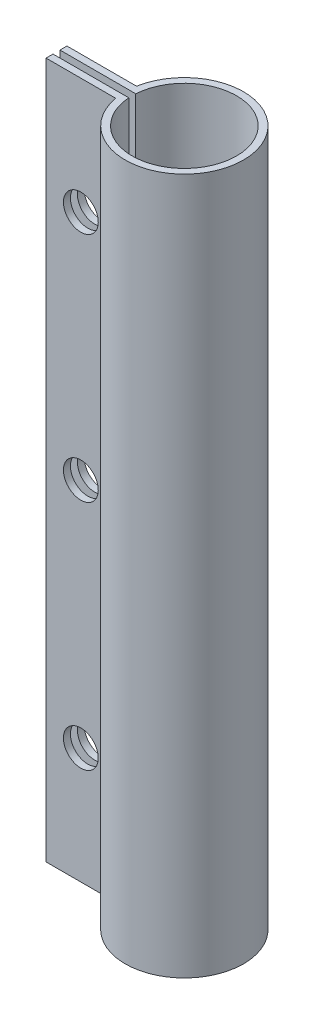
ISO-10303-21;
HEADER;
FILE_DESCRIPTION(('STEP AP214'),'2;1');
FILE_NAME('part.step','',(''),(''),'','','');
FILE_SCHEMA(('AUTOMOTIVE_DESIGN { 1 0 10303 214 1 1 1 1 }'));
ENDSEC;
DATA;
#1=APPLICATION_CONTEXT('core data for automotive mechanical design processes');
#2=APPLICATION_PROTOCOL_DEFINITION('international standard','automotive_design',2000,#1);
#3=PRODUCT_CONTEXT('',#1,'mechanical');
#4=PRODUCT('Part','Part','',(#3));
#5=PRODUCT_RELATED_PRODUCT_CATEGORY('part','',(#4));
#6=PRODUCT_DEFINITION_FORMATION('','',#4);
#7=PRODUCT_DEFINITION_CONTEXT('part definition',#1,'design');
#8=PRODUCT_DEFINITION('design','',#6,#7);
#9=PRODUCT_DEFINITION_SHAPE('','',#8);
#10=(LENGTH_UNIT() NAMED_UNIT(*) SI_UNIT(.MILLI.,.METRE.));
#11=(NAMED_UNIT(*) PLANE_ANGLE_UNIT() SI_UNIT($,.RADIAN.));
#12=(NAMED_UNIT(*) SI_UNIT($,.STERADIAN.) SOLID_ANGLE_UNIT());
#13=UNCERTAINTY_MEASURE_WITH_UNIT(LENGTH_MEASURE(1.E-05),#10,'distance_accuracy_value','');
#14=(GEOMETRIC_REPRESENTATION_CONTEXT(3) GLOBAL_UNCERTAINTY_ASSIGNED_CONTEXT((#13)) GLOBAL_UNIT_ASSIGNED_CONTEXT((#10,
#11,#12)) REPRESENTATION_CONTEXT('',''));
#15=CARTESIAN_POINT('',(0.,0.,0.));
#16=DIRECTION('',(0.,0.,1.));
#17=DIRECTION('',(1.,0.,0.));
#18=AXIS2_PLACEMENT_3D('',#15,#16,#17);
#19=CARTESIAN_POINT('',(0.,50.,0.));
#20=DIRECTION('',(0.,-1.,0.));
#21=DIRECTION('',(0.,0.,-1.));
#22=AXIS2_PLACEMENT_3D('',#19,#20,#21);
#23=CYLINDRICAL_SURFACE('',#22,3.75);
#24=CARTESIAN_POINT('',(0.,0.,0.));
#25=DIRECTION('',(0.,-1.,0.));
#26=DIRECTION('',(0.,0.,-1.));
#27=AXIS2_PLACEMENT_3D('',#24,#25,#26);
#28=CIRCLE('',#27,3.75);
#29=CARTESIAN_POINT('',(-3.74165738677394,0.,-0.25));
#30=VERTEX_POINT('',#29);
#31=CARTESIAN_POINT('',(-3.74165738677394,0.,0.25));
#32=VERTEX_POINT('',#31);
#33=EDGE_CURVE('E132',#30,#32,#28,.T.);
#34=ORIENTED_EDGE('',*,*,#33,.T.);
#35=DIRECTION('',(0.,-1.,0.));
#36=VECTOR('',#35,1.);
#37=CARTESIAN_POINT('',(-3.74165738677394,50.,0.25));
#38=LINE('',#37,#36);
#39=CARTESIAN_POINT('',(-3.74165738677394,50.,0.25));
#40=VERTEX_POINT('',#39);
#41=EDGE_CURVE('E11',#40,#32,#38,.T.);
#42=ORIENTED_EDGE('',*,*,#41,.F.);
#43=CARTESIAN_POINT('',(0.,50.,0.));
#44=DIRECTION('',(0.,-1.,0.));
#45=DIRECTION('',(0.,0.,-1.));
#46=AXIS2_PLACEMENT_3D('',#43,#44,#45);
#47=CIRCLE('',#46,3.75);
#48=CARTESIAN_POINT('',(-3.74165738677394,50.,-0.25));
#49=VERTEX_POINT('',#48);
#50=EDGE_CURVE('E148',#49,#40,#47,.T.);
#51=ORIENTED_EDGE('',*,*,#50,.F.);
#52=DIRECTION('',(0.,-1.,0.));
#53=VECTOR('',#52,1.);
#54=CARTESIAN_POINT('',(-3.74165738677394,50.,-0.25));
#55=LINE('',#54,#53);
#56=EDGE_CURVE('E128',#49,#30,#55,.T.);
#57=ORIENTED_EDGE('',*,*,#56,.T.);
#58=EDGE_LOOP('',(#34,#42,#51,#57));
#59=FACE_BOUND('',#58,.T.);
#60=ADVANCED_FACE('F33',(#59),#23,.F.);
#61=CARTESIAN_POINT('',(-4.18330013267038,50.,0.25));
#62=DIRECTION('',(0.,0.,1.));
#63=DIRECTION('',(1.,0.,0.));
#64=AXIS2_PLACEMENT_3D('',#61,#62,#63);
#65=PLANE('',#64);
#66=CARTESIAN_POINT('',(-6.68330013267038,25.,0.25));
#67=DIRECTION('',(0.,0.,1.));
#68=DIRECTION('',(1.,0.,0.));
#69=AXIS2_PLACEMENT_3D('',#66,#67,#68);
#70=CIRCLE('',#69,1.25);
#71=CARTESIAN_POINT('',(-5.43330013267038,25.,0.25));
#72=VERTEX_POINT('',#71);
#73=EDGE_CURVE('E186',#72,#72,#70,.T.);
#74=ORIENTED_EDGE('',*,*,#73,.T.);
#75=EDGE_LOOP('',(#74));
#76=FACE_BOUND('',#75,.T.);
#77=CARTESIAN_POINT('',(-6.68330013267038,8.33333333333333,0.25));
#78=DIRECTION('',(0.,0.,1.));
#79=DIRECTION('',(1.,0.,0.));
#80=AXIS2_PLACEMENT_3D('',#77,#78,#79);
#81=CIRCLE('',#80,1.25);
#82=CARTESIAN_POINT('',(-5.43330013267038,8.33333333333333,0.25));
#83=VERTEX_POINT('',#82);
#84=EDGE_CURVE('E171',#83,#83,#81,.T.);
#85=ORIENTED_EDGE('',*,*,#84,.T.);
#86=EDGE_LOOP('',(#85));
#87=FACE_BOUND('',#86,.T.);
#88=CARTESIAN_POINT('',(-6.68330013267038,41.6666666666667,0.25));
#89=DIRECTION('',(0.,0.,1.));
#90=DIRECTION('',(1.,0.,0.));
#91=AXIS2_PLACEMENT_3D('',#88,#89,#90);
#92=CIRCLE('',#91,1.25);
#93=CARTESIAN_POINT('',(-5.43330013267038,41.6666666666667,0.25));
#94=VERTEX_POINT('',#93);
#95=EDGE_CURVE('E136',#94,#94,#92,.T.);
#96=ORIENTED_EDGE('',*,*,#95,.T.);
#97=EDGE_LOOP('',(#96));
#98=FACE_BOUND('',#97,.T.);
#99=DIRECTION('',(-1.,0.,0.));
#100=VECTOR('',#99,1.);
#101=CARTESIAN_POINT('',(-4.18330013267038,0.,0.25));
#102=LINE('',#101,#100);
#103=CARTESIAN_POINT('',(-9.18330013267038,0.,0.249999999999999));
#104=VERTEX_POINT('',#103);
#105=EDGE_CURVE('E135',#32,#104,#102,.T.);
#106=ORIENTED_EDGE('',*,*,#105,.T.);
#107=DIRECTION('',(0.,-1.,0.));
#108=VECTOR('',#107,1.);
#109=CARTESIAN_POINT('',(-9.18330013267038,50.,0.249999999999999));
#110=LINE('',#109,#108);
#111=CARTESIAN_POINT('',(-9.18330013267038,50.,0.249999999999999));
#112=VERTEX_POINT('',#111);
#113=EDGE_CURVE('E42',#112,#104,#110,.T.);
#114=ORIENTED_EDGE('',*,*,#113,.F.);
#115=DIRECTION('',(-1.,0.,0.));
#116=VECTOR('',#115,1.);
#117=CARTESIAN_POINT('',(-4.18330013267038,50.,0.25));
#118=LINE('',#117,#116);
#119=EDGE_CURVE('E92',#40,#112,#118,.T.);
#120=ORIENTED_EDGE('',*,*,#119,.F.);
#121=ORIENTED_EDGE('',*,*,#41,.T.);
#122=EDGE_LOOP('',(#106,#114,#120,#121));
#123=FACE_BOUND('',#122,.T.);
#124=ADVANCED_FACE('F215',(#76,#87,#98,#123),#65,.F.);
#125=CARTESIAN_POINT('',(-9.18330013267038,50.,0.249999999999999));
#126=DIRECTION('',(1.,0.,0.));
#127=DIRECTION('',(0.,0.,-1.));
#128=AXIS2_PLACEMENT_3D('',#125,#126,#127);
#129=PLANE('',#128);
#130=DIRECTION('',(0.,0.,1.));
#131=VECTOR('',#130,1.);
#132=CARTESIAN_POINT('',(-9.18330013267038,0.,0.249999999999999));
#133=LINE('',#132,#131);
#134=CARTESIAN_POINT('',(-9.18330013267038,0.,0.750000000000001));
#135=VERTEX_POINT('',#134);
#136=EDGE_CURVE('E138',#104,#135,#133,.T.);
#137=ORIENTED_EDGE('',*,*,#136,.T.);
#138=DIRECTION('',(0.,-1.,0.));
#139=VECTOR('',#138,1.);
#140=CARTESIAN_POINT('',(-9.18330013267038,50.,0.750000000000001));
#141=LINE('',#140,#139);
#142=CARTESIAN_POINT('',(-9.18330013267038,50.,0.750000000000001));
#143=VERTEX_POINT('',#142);
#144=EDGE_CURVE('E155',#143,#135,#141,.T.);
#145=ORIENTED_EDGE('',*,*,#144,.F.);
#146=DIRECTION('',(0.,0.,1.));
#147=VECTOR('',#146,1.);
#148=CARTESIAN_POINT('',(-9.18330013267038,50.,0.249999999999999));
#149=LINE('',#148,#147);
#150=EDGE_CURVE('E197',#112,#143,#149,.T.);
#151=ORIENTED_EDGE('',*,*,#150,.F.);
#152=ORIENTED_EDGE('',*,*,#113,.T.);
#153=EDGE_LOOP('',(#137,#145,#151,#152));
#154=FACE_BOUND('',#153,.T.);
#155=ADVANCED_FACE('F218',(#154),#129,.F.);
#156=CARTESIAN_POINT('',(-4.18330013267038,50.,0.75));
#157=DIRECTION('',(0.,0.,-1.));
#158=DIRECTION('',(-1.,0.,0.));
#159=AXIS2_PLACEMENT_3D('',#156,#157,#158);
#160=PLANE('',#159);
#161=CARTESIAN_POINT('',(-6.68330013267038,25.,0.75));
#162=DIRECTION('',(0.,0.,1.));
#163=DIRECTION('',(1.,0.,0.));
#164=AXIS2_PLACEMENT_3D('',#161,#162,#163);
#165=CIRCLE('',#164,1.25);
#166=CARTESIAN_POINT('',(-5.43330013267038,25.,0.75));
#167=VERTEX_POINT('',#166);
#168=EDGE_CURVE('E167',#167,#167,#165,.T.);
#169=ORIENTED_EDGE('',*,*,#168,.F.);
#170=EDGE_LOOP('',(#169));
#171=FACE_BOUND('',#170,.T.);
#172=CARTESIAN_POINT('',(-6.68330013267038,8.33333333333333,0.75));
#173=DIRECTION('',(0.,0.,1.));
#174=DIRECTION('',(1.,0.,0.));
#175=AXIS2_PLACEMENT_3D('',#172,#173,#174);
#176=CIRCLE('',#175,1.25);
#177=CARTESIAN_POINT('',(-5.43330013267038,8.33333333333333,0.75));
#178=VERTEX_POINT('',#177);
#179=EDGE_CURVE('E174',#178,#178,#176,.T.);
#180=ORIENTED_EDGE('',*,*,#179,.F.);
#181=EDGE_LOOP('',(#180));
#182=FACE_BOUND('',#181,.T.);
#183=CARTESIAN_POINT('',(-6.68330013267038,41.6666666666667,0.75));
#184=DIRECTION('',(0.,0.,1.));
#185=DIRECTION('',(1.,0.,0.));
#186=AXIS2_PLACEMENT_3D('',#183,#184,#185);
#187=CIRCLE('',#186,1.25);
#188=CARTESIAN_POINT('',(-5.43330013267038,41.6666666666667,0.75));
#189=VERTEX_POINT('',#188);
#190=EDGE_CURVE('E163',#189,#189,#187,.T.);
#191=ORIENTED_EDGE('',*,*,#190,.F.);
#192=EDGE_LOOP('',(#191));
#193=FACE_BOUND('',#192,.T.);
#194=DIRECTION('',(1.,0.,0.));
#195=VECTOR('',#194,1.);
#196=CARTESIAN_POINT('',(-4.18330013267038,0.,0.75));
#197=LINE('',#196,#195);
#198=CARTESIAN_POINT('',(-4.18330013267038,0.,0.75));
#199=VERTEX_POINT('',#198);
#200=EDGE_CURVE('E140',#135,#199,#197,.T.);
#201=ORIENTED_EDGE('',*,*,#200,.T.);
#202=DIRECTION('',(0.,-1.,0.));
#203=VECTOR('',#202,1.);
#204=CARTESIAN_POINT('',(-4.18330013267038,50.,0.75));
#205=LINE('',#204,#203);
#206=CARTESIAN_POINT('',(-4.18330013267038,50.,0.75));
#207=VERTEX_POINT('',#206);
#208=EDGE_CURVE('E152',#207,#199,#205,.T.);
#209=ORIENTED_EDGE('',*,*,#208,.F.);
#210=DIRECTION('',(1.,0.,0.));
#211=VECTOR('',#210,1.);
#212=CARTESIAN_POINT('',(-4.18330013267038,50.,0.75));
#213=LINE('',#212,#211);
#214=EDGE_CURVE('E199',#143,#207,#213,.T.);
#215=ORIENTED_EDGE('',*,*,#214,.F.);
#216=ORIENTED_EDGE('',*,*,#144,.T.);
#217=EDGE_LOOP('',(#201,#209,#215,#216));
#218=FACE_BOUND('',#217,.T.);
#219=ADVANCED_FACE('F205',(#171,#182,#193,#218),#160,.F.);
#220=CARTESIAN_POINT('',(0.,50.,0.));
#221=DIRECTION('',(0.,-1.,0.));
#222=DIRECTION('',(0.,0.,-1.));
#223=AXIS2_PLACEMENT_3D('',#220,#221,#222);
#224=CYLINDRICAL_SURFACE('',#223,4.25);
#225=CARTESIAN_POINT('',(0.,0.,0.));
#226=DIRECTION('',(0.,1.,0.));
#227=DIRECTION('',(0.,0.,-1.));
#228=AXIS2_PLACEMENT_3D('',#225,#226,#227);
#229=CIRCLE('',#228,4.25);
#230=CARTESIAN_POINT('',(-4.18330013267038,0.,-0.749999999999998));
#231=VERTEX_POINT('',#230);
#232=EDGE_CURVE('E142',#199,#231,#229,.T.);
#233=ORIENTED_EDGE('',*,*,#232,.T.);
#234=DIRECTION('',(0.,-1.,0.));
#235=VECTOR('',#234,1.);
#236=CARTESIAN_POINT('',(-4.18330013267038,50.,-0.749999999999998));
#237=LINE('',#236,#235);
#238=CARTESIAN_POINT('',(-4.18330013267038,50.,-0.749999999999998));
#239=VERTEX_POINT('',#238);
#240=EDGE_CURVE('E123',#239,#231,#237,.T.);
#241=ORIENTED_EDGE('',*,*,#240,.F.);
#242=CARTESIAN_POINT('',(0.,50.,0.));
#243=DIRECTION('',(0.,1.,0.));
#244=DIRECTION('',(0.,0.,-1.));
#245=AXIS2_PLACEMENT_3D('',#242,#243,#244);
#246=CIRCLE('',#245,4.25);
#247=EDGE_CURVE('E112',#207,#239,#246,.T.);
#248=ORIENTED_EDGE('',*,*,#247,.F.);
#249=ORIENTED_EDGE('',*,*,#208,.T.);
#250=EDGE_LOOP('',(#233,#241,#248,#249));
#251=FACE_BOUND('',#250,.T.);
#252=ADVANCED_FACE('F209',(#251),#224,.T.);
#253=CARTESIAN_POINT('',(-4.18330013267038,50.,-0.75));
#254=DIRECTION('',(0.,0.,1.));
#255=DIRECTION('',(1.,0.,0.));
#256=AXIS2_PLACEMENT_3D('',#253,#254,#255);
#257=PLANE('',#256);
#258=CARTESIAN_POINT('',(-6.68330013267038,25.,-0.750000000000001));
#259=DIRECTION('',(0.,0.,1.));
#260=DIRECTION('',(1.,0.,0.));
#261=AXIS2_PLACEMENT_3D('',#258,#259,#260);
#262=CIRCLE('',#261,1.25);
#263=CARTESIAN_POINT('',(-5.43330013267038,25.,-0.750000000000001));
#264=VERTEX_POINT('',#263);
#265=EDGE_CURVE('E183',#264,#264,#262,.T.);
#266=ORIENTED_EDGE('',*,*,#265,.T.);
#267=EDGE_LOOP('',(#266));
#268=FACE_BOUND('',#267,.T.);
#269=CARTESIAN_POINT('',(-6.68330013267038,8.33333333333333,-0.750000000000001));
#270=DIRECTION('',(0.,0.,1.));
#271=DIRECTION('',(1.,0.,0.));
#272=AXIS2_PLACEMENT_3D('',#269,#270,#271);
#273=CIRCLE('',#272,1.25);
#274=CARTESIAN_POINT('',(-5.43330013267038,8.33333333333333,-0.750000000000001));
#275=VERTEX_POINT('',#274);
#276=EDGE_CURVE('E166',#275,#275,#273,.T.);
#277=ORIENTED_EDGE('',*,*,#276,.T.);
#278=EDGE_LOOP('',(#277));
#279=FACE_BOUND('',#278,.T.);
#280=CARTESIAN_POINT('',(-6.68330013267038,41.6666666666667,-0.750000000000001));
#281=DIRECTION('',(0.,0.,1.));
#282=DIRECTION('',(1.,0.,0.));
#283=AXIS2_PLACEMENT_3D('',#280,#281,#282);
#284=CIRCLE('',#283,1.25);
#285=CARTESIAN_POINT('',(-5.43330013267038,41.6666666666667,-0.750000000000001));
#286=VERTEX_POINT('',#285);
#287=EDGE_CURVE('E162',#286,#286,#284,.T.);
#288=ORIENTED_EDGE('',*,*,#287,.T.);
#289=EDGE_LOOP('',(#288));
#290=FACE_BOUND('',#289,.T.);
#291=DIRECTION('',(-1.,0.,0.));
#292=VECTOR('',#291,1.);
#293=CARTESIAN_POINT('',(-4.18330013267038,0.,-0.75));
#294=LINE('',#293,#292);
#295=CARTESIAN_POINT('',(-9.18330013267038,0.,-0.750000000000001));
#296=VERTEX_POINT('',#295);
#297=EDGE_CURVE('E121',#231,#296,#294,.T.);
#298=ORIENTED_EDGE('',*,*,#297,.T.);
#299=DIRECTION('',(0.,-1.,0.));
#300=VECTOR('',#299,1.);
#301=CARTESIAN_POINT('',(-9.18330013267038,50.,-0.750000000000001));
#302=LINE('',#301,#300);
#303=CARTESIAN_POINT('',(-9.18330013267038,50.,-0.750000000000001));
#304=VERTEX_POINT('',#303);
#305=EDGE_CURVE('E118',#304,#296,#302,.T.);
#306=ORIENTED_EDGE('',*,*,#305,.F.);
#307=DIRECTION('',(-1.,0.,0.));
#308=VECTOR('',#307,1.);
#309=CARTESIAN_POINT('',(-4.18330013267038,50.,-0.75));
#310=LINE('',#309,#308);
#311=EDGE_CURVE('E105',#239,#304,#310,.T.);
#312=ORIENTED_EDGE('',*,*,#311,.F.);
#313=ORIENTED_EDGE('',*,*,#240,.T.);
#314=EDGE_LOOP('',(#298,#306,#312,#313));
#315=FACE_BOUND('',#314,.T.);
#316=ADVANCED_FACE('F119',(#268,#279,#290,#315),#257,.F.);
#317=CARTESIAN_POINT('',(-9.18330013267038,50.,-0.250000000000001));
#318=DIRECTION('',(1.,0.,0.));
#319=DIRECTION('',(0.,0.,-1.));
#320=AXIS2_PLACEMENT_3D('',#317,#318,#319);
#321=PLANE('',#320);
#322=DIRECTION('',(0.,0.,1.));
#323=VECTOR('',#322,1.);
#324=CARTESIAN_POINT('',(-9.18330013267038,0.,-0.250000000000001));
#325=LINE('',#324,#323);
#326=CARTESIAN_POINT('',(-9.18330013267038,0.,-0.250000000000001));
#327=VERTEX_POINT('',#326);
#328=EDGE_CURVE('E145',#296,#327,#325,.T.);
#329=ORIENTED_EDGE('',*,*,#328,.T.);
#330=DIRECTION('',(0.,-1.,0.));
#331=VECTOR('',#330,1.);
#332=CARTESIAN_POINT('',(-9.18330013267038,50.,-0.250000000000001));
#333=LINE('',#332,#331);
#334=CARTESIAN_POINT('',(-9.18330013267038,50.,-0.250000000000001));
#335=VERTEX_POINT('',#334);
#336=EDGE_CURVE('E124',#335,#327,#333,.T.);
#337=ORIENTED_EDGE('',*,*,#336,.F.);
#338=DIRECTION('',(0.,0.,1.));
#339=VECTOR('',#338,1.);
#340=CARTESIAN_POINT('',(-9.18330013267038,50.,-0.250000000000001));
#341=LINE('',#340,#339);
#342=EDGE_CURVE('E109',#304,#335,#341,.T.);
#343=ORIENTED_EDGE('',*,*,#342,.F.);
#344=ORIENTED_EDGE('',*,*,#305,.T.);
#345=EDGE_LOOP('',(#329,#337,#343,#344));
#346=FACE_BOUND('',#345,.T.);
#347=ADVANCED_FACE('F126',(#346),#321,.F.);
#348=CARTESIAN_POINT('',(-4.18330013267038,50.,-0.25));
#349=DIRECTION('',(0.,0.,-1.));
#350=DIRECTION('',(-1.,0.,0.));
#351=AXIS2_PLACEMENT_3D('',#348,#349,#350);
#352=PLANE('',#351);
#353=CARTESIAN_POINT('',(-6.68330013267038,25.,-0.25));
#354=DIRECTION('',(0.,0.,-1.));
#355=DIRECTION('',(-1.,0.,0.));
#356=AXIS2_PLACEMENT_3D('',#353,#354,#355);
#357=CIRCLE('',#356,1.25);
#358=CARTESIAN_POINT('',(-7.93330013267038,25.,-0.25));
#359=VERTEX_POINT('',#358);
#360=EDGE_CURVE('E36',#359,#359,#357,.T.);
#361=ORIENTED_EDGE('',*,*,#360,.T.);
#362=EDGE_LOOP('',(#361));
#363=FACE_BOUND('',#362,.T.);
#364=CARTESIAN_POINT('',(-6.68330013267038,8.33333333333333,-0.25));
#365=DIRECTION('',(0.,0.,-1.));
#366=DIRECTION('',(-1.,0.,0.));
#367=AXIS2_PLACEMENT_3D('',#364,#365,#366);
#368=CIRCLE('',#367,1.25);
#369=CARTESIAN_POINT('',(-7.93330013267038,8.33333333333333,-0.25));
#370=VERTEX_POINT('',#369);
#371=EDGE_CURVE('E164',#370,#370,#368,.T.);
#372=ORIENTED_EDGE('',*,*,#371,.T.);
#373=EDGE_LOOP('',(#372));
#374=FACE_BOUND('',#373,.T.);
#375=CARTESIAN_POINT('',(-6.68330013267038,41.6666666666667,-0.25));
#376=DIRECTION('',(0.,0.,-1.));
#377=DIRECTION('',(-1.,0.,0.));
#378=AXIS2_PLACEMENT_3D('',#375,#376,#377);
#379=CIRCLE('',#378,1.25);
#380=CARTESIAN_POINT('',(-7.93330013267039,41.6666666666667,-0.25));
#381=VERTEX_POINT('',#380);
#382=EDGE_CURVE('E160',#381,#381,#379,.T.);
#383=ORIENTED_EDGE('',*,*,#382,.T.);
#384=EDGE_LOOP('',(#383));
#385=FACE_BOUND('',#384,.T.);
#386=DIRECTION('',(1.,0.,0.));
#387=VECTOR('',#386,1.);
#388=CARTESIAN_POINT('',(-4.18330013267038,0.,-0.25));
#389=LINE('',#388,#387);
#390=EDGE_CURVE('E80',#327,#30,#389,.T.);
#391=ORIENTED_EDGE('',*,*,#390,.T.);
#392=ORIENTED_EDGE('',*,*,#56,.F.);
#393=DIRECTION('',(1.,0.,0.));
#394=VECTOR('',#393,1.);
#395=CARTESIAN_POINT('',(-4.18330013267038,50.,-0.25));
#396=LINE('',#395,#394);
#397=EDGE_CURVE('E51',#335,#49,#396,.T.);
#398=ORIENTED_EDGE('',*,*,#397,.F.);
#399=ORIENTED_EDGE('',*,*,#336,.T.);
#400=EDGE_LOOP('',(#391,#392,#398,#399));
#401=FACE_BOUND('',#400,.T.);
#402=ADVANCED_FACE('F211',(#363,#374,#385,#401),#352,.F.);
#403=CARTESIAN_POINT('',(0.,50.,0.));
#404=DIRECTION('',(0.,-1.,0.));
#405=DIRECTION('',(0.,0.,-1.));
#406=AXIS2_PLACEMENT_3D('',#403,#404,#405);
#407=PLANE('',#406);
#408=ORIENTED_EDGE('',*,*,#50,.T.);
#409=ORIENTED_EDGE('',*,*,#119,.T.);
#410=ORIENTED_EDGE('',*,*,#150,.T.);
#411=ORIENTED_EDGE('',*,*,#214,.T.);
#412=ORIENTED_EDGE('',*,*,#247,.T.);
#413=ORIENTED_EDGE('',*,*,#311,.T.);
#414=ORIENTED_EDGE('',*,*,#342,.T.);
#415=ORIENTED_EDGE('',*,*,#397,.T.);
#416=EDGE_LOOP('',(#408,#409,#410,#411,#412,#413,#414,#415));
#417=FACE_BOUND('',#416,.T.);
#418=ADVANCED_FACE('F107',(#417),#407,.F.);
#419=CARTESIAN_POINT('',(0.,0.,0.));
#420=DIRECTION('',(0.,-1.,0.));
#421=DIRECTION('',(0.,0.,-1.));
#422=AXIS2_PLACEMENT_3D('',#419,#420,#421);
#423=PLANE('',#422);
#424=ORIENTED_EDGE('',*,*,#33,.F.);
#425=ORIENTED_EDGE('',*,*,#390,.F.);
#426=ORIENTED_EDGE('',*,*,#328,.F.);
#427=ORIENTED_EDGE('',*,*,#297,.F.);
#428=ORIENTED_EDGE('',*,*,#232,.F.);
#429=ORIENTED_EDGE('',*,*,#200,.F.);
#430=ORIENTED_EDGE('',*,*,#136,.F.);
#431=ORIENTED_EDGE('',*,*,#105,.F.);
#432=EDGE_LOOP('',(#424,#425,#426,#427,#428,#429,#430,#431));
#433=FACE_BOUND('',#432,.T.);
#434=ADVANCED_FACE('F210',(#433),#423,.T.);
#435=CARTESIAN_POINT('',(-6.68330013267038,41.6666666666667,-4.25));
#436=DIRECTION('',(0.,0.,1.));
#437=DIRECTION('',(1.,0.,0.));
#438=AXIS2_PLACEMENT_3D('',#435,#436,#437);
#439=CYLINDRICAL_SURFACE('',#438,1.25);
#440=ORIENTED_EDGE('',*,*,#382,.F.);
#441=EDGE_LOOP('',(#440));
#442=FACE_BOUND('',#441,.T.);
#443=ORIENTED_EDGE('',*,*,#287,.F.);
#444=EDGE_LOOP('',(#443));
#445=FACE_BOUND('',#444,.T.);
#446=ADVANCED_FACE('F268',(#442,#445),#439,.F.);
#447=ORIENTED_EDGE('',*,*,#190,.T.);
#448=EDGE_LOOP('',(#447));
#449=FACE_BOUND('',#448,.T.);
#450=ORIENTED_EDGE('',*,*,#95,.F.);
#451=EDGE_LOOP('',(#450));
#452=FACE_BOUND('',#451,.T.);
#453=ADVANCED_FACE('F273',(#449,#452),#439,.F.);
#454=CARTESIAN_POINT('',(-6.68330013267038,8.33333333333333,-4.25));
#455=DIRECTION('',(0.,0.,1.));
#456=DIRECTION('',(1.,0.,0.));
#457=AXIS2_PLACEMENT_3D('',#454,#455,#456);
#458=CYLINDRICAL_SURFACE('',#457,1.25);
#459=ORIENTED_EDGE('',*,*,#371,.F.);
#460=EDGE_LOOP('',(#459));
#461=FACE_BOUND('',#460,.T.);
#462=ORIENTED_EDGE('',*,*,#276,.F.);
#463=EDGE_LOOP('',(#462));
#464=FACE_BOUND('',#463,.T.);
#465=ADVANCED_FACE('F283',(#461,#464),#458,.F.);
#466=CARTESIAN_POINT('',(-6.68330013267038,25.,-4.25));
#467=DIRECTION('',(0.,0.,1.));
#468=DIRECTION('',(1.,0.,0.));
#469=AXIS2_PLACEMENT_3D('',#466,#467,#468);
#470=CYLINDRICAL_SURFACE('',#469,1.25);
#471=ORIENTED_EDGE('',*,*,#360,.F.);
#472=EDGE_LOOP('',(#471));
#473=FACE_BOUND('',#472,.T.);
#474=ORIENTED_EDGE('',*,*,#265,.F.);
#475=EDGE_LOOP('',(#474));
#476=FACE_BOUND('',#475,.T.);
#477=ADVANCED_FACE('F292',(#473,#476),#470,.F.);
#478=ORIENTED_EDGE('',*,*,#179,.T.);
#479=EDGE_LOOP('',(#478));
#480=FACE_BOUND('',#479,.T.);
#481=ORIENTED_EDGE('',*,*,#84,.F.);
#482=EDGE_LOOP('',(#481));
#483=FACE_BOUND('',#482,.T.);
#484=ADVANCED_FACE('F295',(#480,#483),#458,.F.);
#485=ORIENTED_EDGE('',*,*,#168,.T.);
#486=EDGE_LOOP('',(#485));
#487=FACE_BOUND('',#486,.T.);
#488=ORIENTED_EDGE('',*,*,#73,.F.);
#489=EDGE_LOOP('',(#488));
#490=FACE_BOUND('',#489,.T.);
#491=ADVANCED_FACE('F305',(#487,#490),#470,.F.);
#492=CLOSED_SHELL('',(#60,#124,#155,#219,#252,#316,#347,#402,#418,#434,#446,#453,#465,#477,#484,#491));
#493=MANIFOLD_SOLID_BREP('B2',#492);
#494=ADVANCED_BREP_SHAPE_REPRESENTATION('',(#18,#493),#14);
#495=SHAPE_DEFINITION_REPRESENTATION(#9,#494);
ENDSEC;
END-ISO-10303-21;
